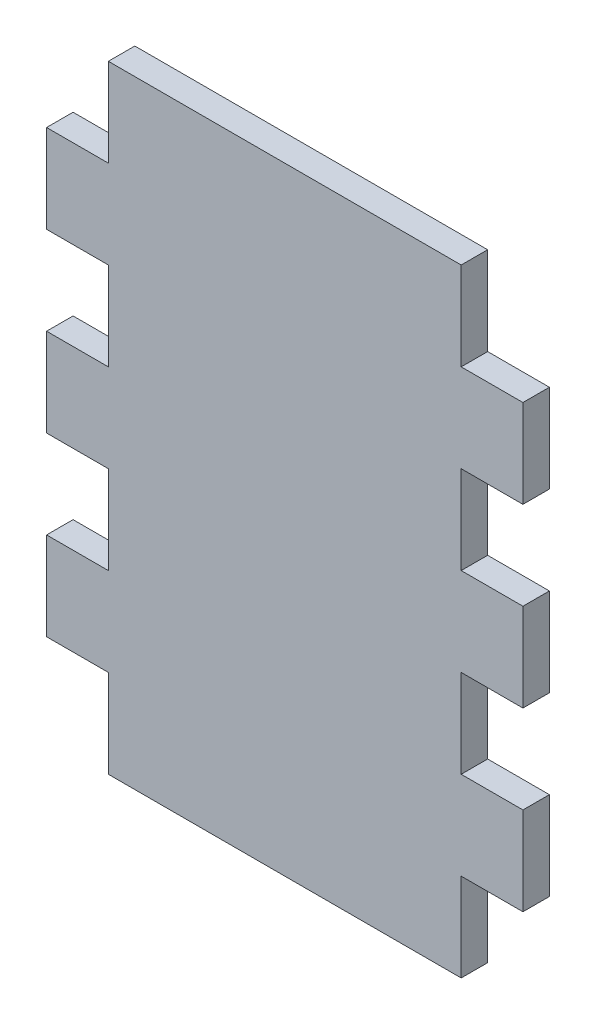
ISO-10303-21;
HEADER;
FILE_DESCRIPTION(('STEP AP214'),'2;1');
FILE_NAME('part.step','',(''),(''),'','','');
FILE_SCHEMA(('AUTOMOTIVE_DESIGN { 1 0 10303 214 1 1 1 1 }'));
ENDSEC;
DATA;
#1=APPLICATION_CONTEXT('core data for automotive mechanical design processes');
#2=APPLICATION_PROTOCOL_DEFINITION('international standard','automotive_design',2000,#1);
#3=PRODUCT_CONTEXT('',#1,'mechanical');
#4=PRODUCT('Part','Part','',(#3));
#5=PRODUCT_RELATED_PRODUCT_CATEGORY('part','',(#4));
#6=PRODUCT_DEFINITION_FORMATION('','',#4);
#7=PRODUCT_DEFINITION_CONTEXT('part definition',#1,'design');
#8=PRODUCT_DEFINITION('design','',#6,#7);
#9=PRODUCT_DEFINITION_SHAPE('','',#8);
#10=(LENGTH_UNIT() NAMED_UNIT(*) SI_UNIT(.MILLI.,.METRE.));
#11=(NAMED_UNIT(*) PLANE_ANGLE_UNIT() SI_UNIT($,.RADIAN.));
#12=(NAMED_UNIT(*) SI_UNIT($,.STERADIAN.) SOLID_ANGLE_UNIT());
#13=UNCERTAINTY_MEASURE_WITH_UNIT(LENGTH_MEASURE(1.E-05),#10,'distance_accuracy_value','');
#14=(GEOMETRIC_REPRESENTATION_CONTEXT(3) GLOBAL_UNCERTAINTY_ASSIGNED_CONTEXT((#13)) GLOBAL_UNIT_ASSIGNED_CONTEXT((#10,
#11,#12)) REPRESENTATION_CONTEXT('',''));
#15=CARTESIAN_POINT('',(0.,0.,0.));
#16=DIRECTION('',(0.,0.,1.));
#17=DIRECTION('',(1.,0.,0.));
#18=AXIS2_PLACEMENT_3D('',#15,#16,#17);
#19=CARTESIAN_POINT('',(0.,25.,3.));
#20=DIRECTION('',(0.,1.,0.));
#21=DIRECTION('',(0.,0.,1.));
#22=AXIS2_PLACEMENT_3D('',#19,#20,#21);
#23=PLANE('',#22);
#24=DIRECTION('',(1.,0.,0.));
#25=VECTOR('',#24,1.);
#26=CARTESIAN_POINT('',(0.,25.,0.));
#27=LINE('',#26,#25);
#28=CARTESIAN_POINT('',(20.,25.,0.));
#29=VERTEX_POINT('',#28);
#30=CARTESIAN_POINT('',(27.,25.,0.));
#31=VERTEX_POINT('',#30);
#32=EDGE_CURVE('E377',#29,#31,#27,.T.);
#33=ORIENTED_EDGE('',*,*,#32,.F.);
#34=DIRECTION('',(0.,0.,-1.));
#35=VECTOR('',#34,1.);
#36=CARTESIAN_POINT('',(20.,25.,3.));
#37=LINE('',#36,#35);
#38=CARTESIAN_POINT('',(20.,25.,3.));
#39=VERTEX_POINT('',#38);
#40=EDGE_CURVE('E211',#39,#29,#37,.T.);
#41=ORIENTED_EDGE('',*,*,#40,.F.);
#42=DIRECTION('',(1.,0.,0.));
#43=VECTOR('',#42,1.);
#44=CARTESIAN_POINT('',(0.,25.,3.));
#45=LINE('',#44,#43);
#46=CARTESIAN_POINT('',(27.,25.,3.));
#47=VERTEX_POINT('',#46);
#48=EDGE_CURVE('E457',#39,#47,#45,.T.);
#49=ORIENTED_EDGE('',*,*,#48,.T.);
#50=DIRECTION('',(0.,0.,-1.));
#51=VECTOR('',#50,1.);
#52=CARTESIAN_POINT('',(27.,25.,3.));
#53=LINE('',#52,#51);
#54=EDGE_CURVE('E207',#47,#31,#53,.T.);
#55=ORIENTED_EDGE('',*,*,#54,.T.);
#56=EDGE_LOOP('',(#33,#41,#49,#55));
#57=FACE_BOUND('',#56,.T.);
#58=ADVANCED_FACE('F127',(#57),#23,.T.);
#59=CARTESIAN_POINT('',(20.,0.,3.));
#60=DIRECTION('',(-1.,0.,0.));
#61=DIRECTION('',(0.,-1.,0.));
#62=AXIS2_PLACEMENT_3D('',#59,#60,#61);
#63=PLANE('',#62);
#64=DIRECTION('',(0.,1.,0.));
#65=VECTOR('',#64,1.);
#66=CARTESIAN_POINT('',(20.,0.,0.));
#67=LINE('',#66,#65);
#68=CARTESIAN_POINT('',(20.,35.,0.));
#69=VERTEX_POINT('',#68);
#70=EDGE_CURVE('E373',#29,#69,#67,.T.);
#71=ORIENTED_EDGE('',*,*,#70,.T.);
#72=DIRECTION('',(0.,0.,-1.));
#73=VECTOR('',#72,1.);
#74=CARTESIAN_POINT('',(20.,35.,3.));
#75=LINE('',#74,#73);
#76=CARTESIAN_POINT('',(20.,35.,3.));
#77=VERTEX_POINT('',#76);
#78=EDGE_CURVE('E215',#77,#69,#75,.T.);
#79=ORIENTED_EDGE('',*,*,#78,.F.);
#80=DIRECTION('',(0.,1.,0.));
#81=VECTOR('',#80,1.);
#82=CARTESIAN_POINT('',(20.,0.,3.));
#83=LINE('',#82,#81);
#84=EDGE_CURVE('E453',#39,#77,#83,.T.);
#85=ORIENTED_EDGE('',*,*,#84,.F.);
#86=ORIENTED_EDGE('',*,*,#40,.T.);
#87=EDGE_LOOP('',(#71,#79,#85,#86));
#88=FACE_BOUND('',#87,.T.);
#89=ADVANCED_FACE('F491',(#88),#63,.F.);
#90=CARTESIAN_POINT('',(0.,35.,3.));
#91=DIRECTION('',(0.,1.,0.));
#92=DIRECTION('',(0.,0.,1.));
#93=AXIS2_PLACEMENT_3D('',#90,#91,#92);
#94=PLANE('',#93);
#95=DIRECTION('',(1.,0.,0.));
#96=VECTOR('',#95,1.);
#97=CARTESIAN_POINT('',(0.,35.,0.));
#98=LINE('',#97,#96);
#99=CARTESIAN_POINT('',(-20.,35.,0.));
#100=VERTEX_POINT('',#99);
#101=EDGE_CURVE('E369',#100,#69,#98,.T.);
#102=ORIENTED_EDGE('',*,*,#101,.F.);
#103=DIRECTION('',(0.,0.,-1.));
#104=VECTOR('',#103,1.);
#105=CARTESIAN_POINT('',(-20.,35.,3.));
#106=LINE('',#105,#104);
#107=CARTESIAN_POINT('',(-20.,35.,3.));
#108=VERTEX_POINT('',#107);
#109=EDGE_CURVE('E219',#108,#100,#106,.T.);
#110=ORIENTED_EDGE('',*,*,#109,.F.);
#111=DIRECTION('',(1.,0.,0.));
#112=VECTOR('',#111,1.);
#113=CARTESIAN_POINT('',(0.,35.,3.));
#114=LINE('',#113,#112);
#115=EDGE_CURVE('E449',#108,#77,#114,.T.);
#116=ORIENTED_EDGE('',*,*,#115,.T.);
#117=ORIENTED_EDGE('',*,*,#78,.T.);
#118=EDGE_LOOP('',(#102,#110,#116,#117));
#119=FACE_BOUND('',#118,.T.);
#120=ADVANCED_FACE('F666',(#119),#94,.T.);
#121=CARTESIAN_POINT('',(-20.,0.,3.));
#122=DIRECTION('',(-1.,0.,0.));
#123=DIRECTION('',(0.,0.,1.));
#124=AXIS2_PLACEMENT_3D('',#121,#122,#123);
#125=PLANE('',#124);
#126=DIRECTION('',(0.,1.,0.));
#127=VECTOR('',#126,1.);
#128=CARTESIAN_POINT('',(-20.,0.,0.));
#129=LINE('',#128,#127);
#130=CARTESIAN_POINT('',(-20.,25.,0.));
#131=VERTEX_POINT('',#130);
#132=EDGE_CURVE('E368',#131,#100,#129,.T.);
#133=ORIENTED_EDGE('',*,*,#132,.F.);
#134=DIRECTION('',(0.,0.,1.));
#135=VECTOR('',#134,1.);
#136=CARTESIAN_POINT('',(-20.,25.,3.));
#137=LINE('',#136,#135);
#138=CARTESIAN_POINT('',(-20.,25.,3.));
#139=VERTEX_POINT('',#138);
#140=EDGE_CURVE('E12',#131,#139,#137,.T.);
#141=ORIENTED_EDGE('',*,*,#140,.T.);
#142=DIRECTION('',(0.,1.,0.));
#143=VECTOR('',#142,1.);
#144=CARTESIAN_POINT('',(-20.,0.,3.));
#145=LINE('',#144,#143);
#146=EDGE_CURVE('E448',#139,#108,#145,.T.);
#147=ORIENTED_EDGE('',*,*,#146,.T.);
#148=ORIENTED_EDGE('',*,*,#109,.T.);
#149=EDGE_LOOP('',(#133,#141,#147,#148));
#150=FACE_BOUND('',#149,.T.);
#151=ADVANCED_FACE('F597',(#150),#125,.T.);
#152=DIRECTION('',(0.,0.,1.));
#153=VECTOR('',#152,1.);
#154=CARTESIAN_POINT('',(-20.,15.,3.));
#155=LINE('',#154,#153);
#156=CARTESIAN_POINT('',(-20.,15.,0.));
#157=VERTEX_POINT('',#156);
#158=CARTESIAN_POINT('',(-20.,15.,3.));
#159=VERTEX_POINT('',#158);
#160=EDGE_CURVE('E138',#157,#159,#155,.T.);
#161=ORIENTED_EDGE('',*,*,#160,.F.);
#162=CARTESIAN_POINT('',(-20.,4.99999999999998,0.));
#163=VERTEX_POINT('',#162);
#164=EDGE_CURVE('E190',#163,#157,#129,.T.);
#165=ORIENTED_EDGE('',*,*,#164,.F.);
#166=DIRECTION('',(0.,0.,-1.));
#167=VECTOR('',#166,1.);
#168=CARTESIAN_POINT('',(-20.,4.99999999999998,3.));
#169=LINE('',#168,#167);
#170=CARTESIAN_POINT('',(-20.,4.99999999999998,3.));
#171=VERTEX_POINT('',#170);
#172=EDGE_CURVE('E223',#171,#163,#169,.T.);
#173=ORIENTED_EDGE('',*,*,#172,.F.);
#174=EDGE_CURVE('E444',#171,#159,#145,.T.);
#175=ORIENTED_EDGE('',*,*,#174,.T.);
#176=EDGE_LOOP('',(#161,#165,#173,#175));
#177=FACE_BOUND('',#176,.T.);
#178=ADVANCED_FACE('F627',(#177),#125,.T.);
#179=CARTESIAN_POINT('',(0.,4.99999999999999,3.));
#180=DIRECTION('',(0.,-1.,0.));
#181=DIRECTION('',(1.,0.,0.));
#182=AXIS2_PLACEMENT_3D('',#179,#180,#181);
#183=PLANE('',#182);
#184=DIRECTION('',(-1.,0.,0.));
#185=VECTOR('',#184,1.);
#186=CARTESIAN_POINT('',(0.,4.99999999999999,0.));
#187=LINE('',#186,#185);
#188=CARTESIAN_POINT('',(-27.,4.99999999999998,0.));
#189=VERTEX_POINT('',#188);
#190=EDGE_CURVE('E362',#163,#189,#187,.T.);
#191=ORIENTED_EDGE('',*,*,#190,.T.);
#192=DIRECTION('',(0.,0.,-1.));
#193=VECTOR('',#192,1.);
#194=CARTESIAN_POINT('',(-27.,4.99999999999998,3.));
#195=LINE('',#194,#193);
#196=CARTESIAN_POINT('',(-27.,4.99999999999998,3.));
#197=VERTEX_POINT('',#196);
#198=EDGE_CURVE('E227',#197,#189,#195,.T.);
#199=ORIENTED_EDGE('',*,*,#198,.F.);
#200=DIRECTION('',(-1.,0.,0.));
#201=VECTOR('',#200,1.);
#202=CARTESIAN_POINT('',(0.,4.99999999999999,3.));
#203=LINE('',#202,#201);
#204=EDGE_CURVE('E440',#171,#197,#203,.T.);
#205=ORIENTED_EDGE('',*,*,#204,.F.);
#206=ORIENTED_EDGE('',*,*,#172,.T.);
#207=EDGE_LOOP('',(#191,#199,#205,#206));
#208=FACE_BOUND('',#207,.T.);
#209=ADVANCED_FACE('F651',(#208),#183,.F.);
#210=CARTESIAN_POINT('',(-27.,0.,3.));
#211=DIRECTION('',(1.,0.,0.));
#212=DIRECTION('',(0.,1.,0.));
#213=AXIS2_PLACEMENT_3D('',#210,#211,#212);
#214=PLANE('',#213);
#215=DIRECTION('',(0.,-1.,0.));
#216=VECTOR('',#215,1.);
#217=CARTESIAN_POINT('',(-27.,0.,0.));
#218=LINE('',#217,#216);
#219=CARTESIAN_POINT('',(-27.,-5.00000000000002,0.));
#220=VERTEX_POINT('',#219);
#221=EDGE_CURVE('E358',#189,#220,#218,.T.);
#222=ORIENTED_EDGE('',*,*,#221,.T.);
#223=DIRECTION('',(0.,0.,-1.));
#224=VECTOR('',#223,1.);
#225=CARTESIAN_POINT('',(-27.,-5.00000000000002,3.));
#226=LINE('',#225,#224);
#227=CARTESIAN_POINT('',(-27.,-5.00000000000002,3.));
#228=VERTEX_POINT('',#227);
#229=EDGE_CURVE('E231',#228,#220,#226,.T.);
#230=ORIENTED_EDGE('',*,*,#229,.F.);
#231=DIRECTION('',(0.,-1.,0.));
#232=VECTOR('',#231,1.);
#233=CARTESIAN_POINT('',(-27.,0.,3.));
#234=LINE('',#233,#232);
#235=EDGE_CURVE('E436',#197,#228,#234,.T.);
#236=ORIENTED_EDGE('',*,*,#235,.F.);
#237=ORIENTED_EDGE('',*,*,#198,.T.);
#238=EDGE_LOOP('',(#222,#230,#236,#237));
#239=FACE_BOUND('',#238,.T.);
#240=ADVANCED_FACE('F623',(#239),#214,.F.);
#241=CARTESIAN_POINT('',(0.,-5.00000000000001,3.));
#242=DIRECTION('',(0.,-1.,0.));
#243=DIRECTION('',(1.,0.,0.));
#244=AXIS2_PLACEMENT_3D('',#241,#242,#243);
#245=PLANE('',#244);
#246=DIRECTION('',(-1.,0.,0.));
#247=VECTOR('',#246,1.);
#248=CARTESIAN_POINT('',(0.,-5.00000000000001,0.));
#249=LINE('',#248,#247);
#250=CARTESIAN_POINT('',(-20.,-5.00000000000002,0.));
#251=VERTEX_POINT('',#250);
#252=EDGE_CURVE('E354',#251,#220,#249,.T.);
#253=ORIENTED_EDGE('',*,*,#252,.F.);
#254=DIRECTION('',(0.,0.,-1.));
#255=VECTOR('',#254,1.);
#256=CARTESIAN_POINT('',(-20.,-5.00000000000002,3.));
#257=LINE('',#256,#255);
#258=CARTESIAN_POINT('',(-20.,-5.00000000000002,3.));
#259=VERTEX_POINT('',#258);
#260=EDGE_CURVE('E235',#259,#251,#257,.T.);
#261=ORIENTED_EDGE('',*,*,#260,.F.);
#262=DIRECTION('',(-1.,0.,0.));
#263=VECTOR('',#262,1.);
#264=CARTESIAN_POINT('',(0.,-5.00000000000001,3.));
#265=LINE('',#264,#263);
#266=EDGE_CURVE('E432',#259,#228,#265,.T.);
#267=ORIENTED_EDGE('',*,*,#266,.T.);
#268=ORIENTED_EDGE('',*,*,#229,.T.);
#269=EDGE_LOOP('',(#253,#261,#267,#268));
#270=FACE_BOUND('',#269,.T.);
#271=ADVANCED_FACE('F619',(#270),#245,.T.);
#272=CARTESIAN_POINT('',(-20.,-15.,0.));
#273=VERTEX_POINT('',#272);
#274=EDGE_CURVE('E353',#273,#251,#129,.T.);
#275=ORIENTED_EDGE('',*,*,#274,.F.);
#276=DIRECTION('',(0.,0.,-1.));
#277=VECTOR('',#276,1.);
#278=CARTESIAN_POINT('',(-20.,-15.,3.));
#279=LINE('',#278,#277);
#280=CARTESIAN_POINT('',(-20.,-15.,3.));
#281=VERTEX_POINT('',#280);
#282=EDGE_CURVE('E239',#281,#273,#279,.T.);
#283=ORIENTED_EDGE('',*,*,#282,.F.);
#284=EDGE_CURVE('E431',#281,#259,#145,.T.);
#285=ORIENTED_EDGE('',*,*,#284,.T.);
#286=ORIENTED_EDGE('',*,*,#260,.T.);
#287=EDGE_LOOP('',(#275,#283,#285,#286));
#288=FACE_BOUND('',#287,.T.);
#289=ADVANCED_FACE('F613',(#288),#125,.T.);
#290=CARTESIAN_POINT('',(0.,-15.,3.));
#291=DIRECTION('',(0.,-1.,0.));
#292=DIRECTION('',(1.,0.,0.));
#293=AXIS2_PLACEMENT_3D('',#290,#291,#292);
#294=PLANE('',#293);
#295=DIRECTION('',(-1.,0.,0.));
#296=VECTOR('',#295,1.);
#297=CARTESIAN_POINT('',(0.,-15.,0.));
#298=LINE('',#297,#296);
#299=CARTESIAN_POINT('',(-27.,-15.,0.));
#300=VERTEX_POINT('',#299);
#301=EDGE_CURVE('E349',#273,#300,#298,.T.);
#302=ORIENTED_EDGE('',*,*,#301,.T.);
#303=DIRECTION('',(0.,0.,-1.));
#304=VECTOR('',#303,1.);
#305=CARTESIAN_POINT('',(-27.,-15.,3.));
#306=LINE('',#305,#304);
#307=CARTESIAN_POINT('',(-27.,-15.,3.));
#308=VERTEX_POINT('',#307);
#309=EDGE_CURVE('E243',#308,#300,#306,.T.);
#310=ORIENTED_EDGE('',*,*,#309,.F.);
#311=DIRECTION('',(-1.,0.,0.));
#312=VECTOR('',#311,1.);
#313=CARTESIAN_POINT('',(0.,-15.,3.));
#314=LINE('',#313,#312);
#315=EDGE_CURVE('E427',#281,#308,#314,.T.);
#316=ORIENTED_EDGE('',*,*,#315,.F.);
#317=ORIENTED_EDGE('',*,*,#282,.T.);
#318=EDGE_LOOP('',(#302,#310,#316,#317));
#319=FACE_BOUND('',#318,.T.);
#320=ADVANCED_FACE('F650',(#319),#294,.F.);
#321=CARTESIAN_POINT('',(-27.,0.,3.));
#322=DIRECTION('',(1.,0.,0.));
#323=DIRECTION('',(0.,0.,-1.));
#324=AXIS2_PLACEMENT_3D('',#321,#322,#323);
#325=PLANE('',#324);
#326=DIRECTION('',(0.,-1.,0.));
#327=VECTOR('',#326,1.);
#328=CARTESIAN_POINT('',(-27.,0.,0.));
#329=LINE('',#328,#327);
#330=CARTESIAN_POINT('',(-27.,-25.,0.));
#331=VERTEX_POINT('',#330);
#332=EDGE_CURVE('E345',#300,#331,#329,.T.);
#333=ORIENTED_EDGE('',*,*,#332,.T.);
#334=DIRECTION('',(0.,0.,-1.));
#335=VECTOR('',#334,1.);
#336=CARTESIAN_POINT('',(-27.,-25.,3.));
#337=LINE('',#336,#335);
#338=CARTESIAN_POINT('',(-27.,-25.,3.));
#339=VERTEX_POINT('',#338);
#340=EDGE_CURVE('E247',#339,#331,#337,.T.);
#341=ORIENTED_EDGE('',*,*,#340,.F.);
#342=DIRECTION('',(0.,-1.,0.));
#343=VECTOR('',#342,1.);
#344=CARTESIAN_POINT('',(-27.,0.,3.));
#345=LINE('',#344,#343);
#346=EDGE_CURVE('E423',#308,#339,#345,.T.);
#347=ORIENTED_EDGE('',*,*,#346,.F.);
#348=ORIENTED_EDGE('',*,*,#309,.T.);
#349=EDGE_LOOP('',(#333,#341,#347,#348));
#350=FACE_BOUND('',#349,.T.);
#351=ADVANCED_FACE('F647',(#350),#325,.F.);
#352=CARTESIAN_POINT('',(0.,-25.,3.));
#353=DIRECTION('',(0.,-1.,0.));
#354=DIRECTION('',(1.,0.,0.));
#355=AXIS2_PLACEMENT_3D('',#352,#353,#354);
#356=PLANE('',#355);
#357=DIRECTION('',(-1.,0.,0.));
#358=VECTOR('',#357,1.);
#359=CARTESIAN_POINT('',(0.,-25.,0.));
#360=LINE('',#359,#358);
#361=CARTESIAN_POINT('',(-20.,-25.,0.));
#362=VERTEX_POINT('',#361);
#363=EDGE_CURVE('E341',#362,#331,#360,.T.);
#364=ORIENTED_EDGE('',*,*,#363,.F.);
#365=DIRECTION('',(0.,0.,-1.));
#366=VECTOR('',#365,1.);
#367=CARTESIAN_POINT('',(-20.,-25.,3.));
#368=LINE('',#367,#366);
#369=CARTESIAN_POINT('',(-20.,-25.,3.));
#370=VERTEX_POINT('',#369);
#371=EDGE_CURVE('E251',#370,#362,#368,.T.);
#372=ORIENTED_EDGE('',*,*,#371,.F.);
#373=DIRECTION('',(-1.,0.,0.));
#374=VECTOR('',#373,1.);
#375=CARTESIAN_POINT('',(0.,-25.,3.));
#376=LINE('',#375,#374);
#377=EDGE_CURVE('E419',#370,#339,#376,.T.);
#378=ORIENTED_EDGE('',*,*,#377,.T.);
#379=ORIENTED_EDGE('',*,*,#340,.T.);
#380=EDGE_LOOP('',(#364,#372,#378,#379));
#381=FACE_BOUND('',#380,.T.);
#382=ADVANCED_FACE('F645',(#381),#356,.T.);
#383=CARTESIAN_POINT('',(-20.,-35.,0.));
#384=VERTEX_POINT('',#383);
#385=EDGE_CURVE('E340',#384,#362,#129,.T.);
#386=ORIENTED_EDGE('',*,*,#385,.F.);
#387=DIRECTION('',(0.,0.,-1.));
#388=VECTOR('',#387,1.);
#389=CARTESIAN_POINT('',(-20.,-35.,3.));
#390=LINE('',#389,#388);
#391=CARTESIAN_POINT('',(-20.,-35.,3.));
#392=VERTEX_POINT('',#391);
#393=EDGE_CURVE('E255',#392,#384,#390,.T.);
#394=ORIENTED_EDGE('',*,*,#393,.F.);
#395=EDGE_CURVE('E418',#392,#370,#145,.T.);
#396=ORIENTED_EDGE('',*,*,#395,.T.);
#397=ORIENTED_EDGE('',*,*,#371,.T.);
#398=EDGE_LOOP('',(#386,#394,#396,#397));
#399=FACE_BOUND('',#398,.T.);
#400=ADVANCED_FACE('F637',(#399),#125,.T.);
#401=CARTESIAN_POINT('',(0.,-35.,3.));
#402=DIRECTION('',(0.,1.,0.));
#403=DIRECTION('',(-1.,0.,0.));
#404=AXIS2_PLACEMENT_3D('',#401,#402,#403);
#405=PLANE('',#404);
#406=DIRECTION('',(1.,0.,0.));
#407=VECTOR('',#406,1.);
#408=CARTESIAN_POINT('',(0.,-35.,0.));
#409=LINE('',#408,#407);
#410=CARTESIAN_POINT('',(20.,-35.,0.));
#411=VERTEX_POINT('',#410);
#412=EDGE_CURVE('E336',#384,#411,#409,.T.);
#413=ORIENTED_EDGE('',*,*,#412,.T.);
#414=DIRECTION('',(0.,0.,-1.));
#415=VECTOR('',#414,1.);
#416=CARTESIAN_POINT('',(20.,-35.,3.));
#417=LINE('',#416,#415);
#418=CARTESIAN_POINT('',(20.,-35.,3.));
#419=VERTEX_POINT('',#418);
#420=EDGE_CURVE('E259',#419,#411,#417,.T.);
#421=ORIENTED_EDGE('',*,*,#420,.F.);
#422=DIRECTION('',(1.,0.,0.));
#423=VECTOR('',#422,1.);
#424=CARTESIAN_POINT('',(0.,-35.,3.));
#425=LINE('',#424,#423);
#426=EDGE_CURVE('E414',#392,#419,#425,.T.);
#427=ORIENTED_EDGE('',*,*,#426,.F.);
#428=ORIENTED_EDGE('',*,*,#393,.T.);
#429=EDGE_LOOP('',(#413,#421,#427,#428));
#430=FACE_BOUND('',#429,.T.);
#431=ADVANCED_FACE('F814',(#430),#405,.F.);
#432=CARTESIAN_POINT('',(20.,-25.,0.));
#433=VERTEX_POINT('',#432);
#434=EDGE_CURVE('E335',#411,#433,#67,.T.);
#435=ORIENTED_EDGE('',*,*,#434,.T.);
#436=DIRECTION('',(0.,0.,-1.));
#437=VECTOR('',#436,1.);
#438=CARTESIAN_POINT('',(20.,-25.,3.));
#439=LINE('',#438,#437);
#440=CARTESIAN_POINT('',(20.,-25.,3.));
#441=VERTEX_POINT('',#440);
#442=EDGE_CURVE('E263',#441,#433,#439,.T.);
#443=ORIENTED_EDGE('',*,*,#442,.F.);
#444=EDGE_CURVE('E413',#419,#441,#83,.T.);
#445=ORIENTED_EDGE('',*,*,#444,.F.);
#446=ORIENTED_EDGE('',*,*,#420,.T.);
#447=EDGE_LOOP('',(#435,#443,#445,#446));
#448=FACE_BOUND('',#447,.T.);
#449=ADVANCED_FACE('F668',(#448),#63,.F.);
#450=CARTESIAN_POINT('',(0.,-25.,3.));
#451=DIRECTION('',(0.,1.,0.));
#452=DIRECTION('',(0.,0.,1.));
#453=AXIS2_PLACEMENT_3D('',#450,#451,#452);
#454=PLANE('',#453);
#455=DIRECTION('',(1.,0.,0.));
#456=VECTOR('',#455,1.);
#457=CARTESIAN_POINT('',(0.,-25.,0.));
#458=LINE('',#457,#456);
#459=CARTESIAN_POINT('',(27.,-25.,0.));
#460=VERTEX_POINT('',#459);
#461=EDGE_CURVE('E331',#433,#460,#458,.T.);
#462=ORIENTED_EDGE('',*,*,#461,.T.);
#463=DIRECTION('',(0.,0.,-1.));
#464=VECTOR('',#463,1.);
#465=CARTESIAN_POINT('',(27.,-25.,3.));
#466=LINE('',#465,#464);
#467=CARTESIAN_POINT('',(27.,-25.,3.));
#468=VERTEX_POINT('',#467);
#469=EDGE_CURVE('E267',#468,#460,#466,.T.);
#470=ORIENTED_EDGE('',*,*,#469,.F.);
#471=DIRECTION('',(1.,0.,0.));
#472=VECTOR('',#471,1.);
#473=CARTESIAN_POINT('',(0.,-25.,3.));
#474=LINE('',#473,#472);
#475=EDGE_CURVE('E409',#441,#468,#474,.T.);
#476=ORIENTED_EDGE('',*,*,#475,.F.);
#477=ORIENTED_EDGE('',*,*,#442,.T.);
#478=EDGE_LOOP('',(#462,#470,#476,#477));
#479=FACE_BOUND('',#478,.T.);
#480=ADVANCED_FACE('F795',(#479),#454,.F.);
#481=CARTESIAN_POINT('',(27.,0.,3.));
#482=DIRECTION('',(1.,0.,0.));
#483=DIRECTION('',(0.,0.,-1.));
#484=AXIS2_PLACEMENT_3D('',#481,#482,#483);
#485=PLANE('',#484);
#486=DIRECTION('',(0.,-1.,0.));
#487=VECTOR('',#486,1.);
#488=CARTESIAN_POINT('',(27.,0.,0.));
#489=LINE('',#488,#487);
#490=CARTESIAN_POINT('',(27.,-15.,0.));
#491=VERTEX_POINT('',#490);
#492=EDGE_CURVE('E327',#491,#460,#489,.T.);
#493=ORIENTED_EDGE('',*,*,#492,.F.);
#494=DIRECTION('',(0.,0.,-1.));
#495=VECTOR('',#494,1.);
#496=CARTESIAN_POINT('',(27.,-15.,3.));
#497=LINE('',#496,#495);
#498=CARTESIAN_POINT('',(27.,-15.,3.));
#499=VERTEX_POINT('',#498);
#500=EDGE_CURVE('E271',#499,#491,#497,.T.);
#501=ORIENTED_EDGE('',*,*,#500,.F.);
#502=DIRECTION('',(0.,-1.,0.));
#503=VECTOR('',#502,1.);
#504=CARTESIAN_POINT('',(27.,0.,3.));
#505=LINE('',#504,#503);
#506=EDGE_CURVE('E405',#499,#468,#505,.T.);
#507=ORIENTED_EDGE('',*,*,#506,.T.);
#508=ORIENTED_EDGE('',*,*,#469,.T.);
#509=EDGE_LOOP('',(#493,#501,#507,#508));
#510=FACE_BOUND('',#509,.T.);
#511=ADVANCED_FACE('F784',(#510),#485,.T.);
#512=CARTESIAN_POINT('',(0.,-15.,3.));
#513=DIRECTION('',(0.,1.,0.));
#514=DIRECTION('',(0.,0.,1.));
#515=AXIS2_PLACEMENT_3D('',#512,#513,#514);
#516=PLANE('',#515);
#517=DIRECTION('',(1.,0.,0.));
#518=VECTOR('',#517,1.);
#519=CARTESIAN_POINT('',(0.,-15.,0.));
#520=LINE('',#519,#518);
#521=CARTESIAN_POINT('',(20.,-15.,0.));
#522=VERTEX_POINT('',#521);
#523=EDGE_CURVE('E323',#522,#491,#520,.T.);
#524=ORIENTED_EDGE('',*,*,#523,.F.);
#525=DIRECTION('',(0.,0.,-1.));
#526=VECTOR('',#525,1.);
#527=CARTESIAN_POINT('',(20.,-15.,3.));
#528=LINE('',#527,#526);
#529=CARTESIAN_POINT('',(20.,-15.,3.));
#530=VERTEX_POINT('',#529);
#531=EDGE_CURVE('E275',#530,#522,#528,.T.);
#532=ORIENTED_EDGE('',*,*,#531,.F.);
#533=DIRECTION('',(1.,0.,0.));
#534=VECTOR('',#533,1.);
#535=CARTESIAN_POINT('',(0.,-15.,3.));
#536=LINE('',#535,#534);
#537=EDGE_CURVE('E401',#530,#499,#536,.T.);
#538=ORIENTED_EDGE('',*,*,#537,.T.);
#539=ORIENTED_EDGE('',*,*,#500,.T.);
#540=EDGE_LOOP('',(#524,#532,#538,#539));
#541=FACE_BOUND('',#540,.T.);
#542=ADVANCED_FACE('F774',(#541),#516,.T.);
#543=CARTESIAN_POINT('',(20.,-5.00000000000001,0.));
#544=VERTEX_POINT('',#543);
#545=EDGE_CURVE('E322',#522,#544,#67,.T.);
#546=ORIENTED_EDGE('',*,*,#545,.T.);
#547=DIRECTION('',(0.,0.,-1.));
#548=VECTOR('',#547,1.);
#549=CARTESIAN_POINT('',(20.,-5.00000000000001,3.));
#550=LINE('',#549,#548);
#551=CARTESIAN_POINT('',(20.,-5.00000000000001,3.));
#552=VERTEX_POINT('',#551);
#553=EDGE_CURVE('E279',#552,#544,#550,.T.);
#554=ORIENTED_EDGE('',*,*,#553,.F.);
#555=EDGE_CURVE('E400',#530,#552,#83,.T.);
#556=ORIENTED_EDGE('',*,*,#555,.F.);
#557=ORIENTED_EDGE('',*,*,#531,.T.);
#558=EDGE_LOOP('',(#546,#554,#556,#557));
#559=FACE_BOUND('',#558,.T.);
#560=ADVANCED_FACE('F735',(#559),#63,.F.);
#561=CARTESIAN_POINT('',(0.,-5.00000000000001,3.));
#562=DIRECTION('',(0.,1.,0.));
#563=DIRECTION('',(-1.,0.,0.));
#564=AXIS2_PLACEMENT_3D('',#561,#562,#563);
#565=PLANE('',#564);
#566=DIRECTION('',(1.,0.,0.));
#567=VECTOR('',#566,1.);
#568=CARTESIAN_POINT('',(0.,-5.00000000000001,0.));
#569=LINE('',#568,#567);
#570=CARTESIAN_POINT('',(27.,-5.00000000000001,0.));
#571=VERTEX_POINT('',#570);
#572=EDGE_CURVE('E318',#544,#571,#569,.T.);
#573=ORIENTED_EDGE('',*,*,#572,.T.);
#574=DIRECTION('',(0.,0.,-1.));
#575=VECTOR('',#574,1.);
#576=CARTESIAN_POINT('',(27.,-5.00000000000001,3.));
#577=LINE('',#576,#575);
#578=CARTESIAN_POINT('',(27.,-5.00000000000001,3.));
#579=VERTEX_POINT('',#578);
#580=EDGE_CURVE('E283',#579,#571,#577,.T.);
#581=ORIENTED_EDGE('',*,*,#580,.F.);
#582=DIRECTION('',(1.,0.,0.));
#583=VECTOR('',#582,1.);
#584=CARTESIAN_POINT('',(0.,-5.00000000000001,3.));
#585=LINE('',#584,#583);
#586=EDGE_CURVE('E396',#552,#579,#585,.T.);
#587=ORIENTED_EDGE('',*,*,#586,.F.);
#588=ORIENTED_EDGE('',*,*,#553,.T.);
#589=EDGE_LOOP('',(#573,#581,#587,#588));
#590=FACE_BOUND('',#589,.T.);
#591=ADVANCED_FACE('F755',(#590),#565,.F.);
#592=CARTESIAN_POINT('',(27.,0.,3.));
#593=DIRECTION('',(1.,0.,0.));
#594=DIRECTION('',(0.,1.,0.));
#595=AXIS2_PLACEMENT_3D('',#592,#593,#594);
#596=PLANE('',#595);
#597=DIRECTION('',(0.,-1.,0.));
#598=VECTOR('',#597,1.);
#599=CARTESIAN_POINT('',(27.,0.,0.));
#600=LINE('',#599,#598);
#601=CARTESIAN_POINT('',(27.,4.99999999999999,0.));
#602=VERTEX_POINT('',#601);
#603=EDGE_CURVE('E314',#602,#571,#600,.T.);
#604=ORIENTED_EDGE('',*,*,#603,.F.);
#605=DIRECTION('',(0.,0.,-1.));
#606=VECTOR('',#605,1.);
#607=CARTESIAN_POINT('',(27.,4.99999999999999,3.));
#608=LINE('',#607,#606);
#609=CARTESIAN_POINT('',(27.,4.99999999999999,3.));
#610=VERTEX_POINT('',#609);
#611=EDGE_CURVE('E287',#610,#602,#608,.T.);
#612=ORIENTED_EDGE('',*,*,#611,.F.);
#613=DIRECTION('',(0.,-1.,0.));
#614=VECTOR('',#613,1.);
#615=CARTESIAN_POINT('',(27.,0.,3.));
#616=LINE('',#615,#614);
#617=EDGE_CURVE('E392',#610,#579,#616,.T.);
#618=ORIENTED_EDGE('',*,*,#617,.T.);
#619=ORIENTED_EDGE('',*,*,#580,.T.);
#620=EDGE_LOOP('',(#604,#612,#618,#619));
#621=FACE_BOUND('',#620,.T.);
#622=ADVANCED_FACE('F744',(#621),#596,.T.);
#623=CARTESIAN_POINT('',(0.,4.99999999999999,3.));
#624=DIRECTION('',(0.,1.,0.));
#625=DIRECTION('',(-1.,0.,0.));
#626=AXIS2_PLACEMENT_3D('',#623,#624,#625);
#627=PLANE('',#626);
#628=DIRECTION('',(1.,0.,0.));
#629=VECTOR('',#628,1.);
#630=CARTESIAN_POINT('',(0.,4.99999999999999,0.));
#631=LINE('',#630,#629);
#632=CARTESIAN_POINT('',(20.,4.99999999999999,0.));
#633=VERTEX_POINT('',#632);
#634=EDGE_CURVE('E310',#633,#602,#631,.T.);
#635=ORIENTED_EDGE('',*,*,#634,.F.);
#636=DIRECTION('',(0.,0.,-1.));
#637=VECTOR('',#636,1.);
#638=CARTESIAN_POINT('',(20.,4.99999999999999,3.));
#639=LINE('',#638,#637);
#640=CARTESIAN_POINT('',(20.,4.99999999999999,3.));
#641=VERTEX_POINT('',#640);
#642=EDGE_CURVE('E291',#641,#633,#639,.T.);
#643=ORIENTED_EDGE('',*,*,#642,.F.);
#644=DIRECTION('',(1.,0.,0.));
#645=VECTOR('',#644,1.);
#646=CARTESIAN_POINT('',(0.,4.99999999999999,3.));
#647=LINE('',#646,#645);
#648=EDGE_CURVE('E388',#641,#610,#647,.T.);
#649=ORIENTED_EDGE('',*,*,#648,.T.);
#650=ORIENTED_EDGE('',*,*,#611,.T.);
#651=EDGE_LOOP('',(#635,#643,#649,#650));
#652=FACE_BOUND('',#651,.T.);
#653=ADVANCED_FACE('F733',(#652),#627,.T.);
#654=CARTESIAN_POINT('',(20.,15.,0.));
#655=VERTEX_POINT('',#654);
#656=EDGE_CURVE('E309',#633,#655,#67,.T.);
#657=ORIENTED_EDGE('',*,*,#656,.T.);
#658=DIRECTION('',(0.,0.,-1.));
#659=VECTOR('',#658,1.);
#660=CARTESIAN_POINT('',(20.,15.,3.));
#661=LINE('',#660,#659);
#662=CARTESIAN_POINT('',(20.,15.,3.));
#663=VERTEX_POINT('',#662);
#664=EDGE_CURVE('E295',#663,#655,#661,.T.);
#665=ORIENTED_EDGE('',*,*,#664,.F.);
#666=EDGE_CURVE('E387',#641,#663,#83,.T.);
#667=ORIENTED_EDGE('',*,*,#666,.F.);
#668=ORIENTED_EDGE('',*,*,#642,.T.);
#669=EDGE_LOOP('',(#657,#665,#667,#668));
#670=FACE_BOUND('',#669,.T.);
#671=ADVANCED_FACE('F669',(#670),#63,.F.);
#672=CARTESIAN_POINT('',(0.,15.,3.));
#673=DIRECTION('',(0.,1.,0.));
#674=DIRECTION('',(0.,0.,1.));
#675=AXIS2_PLACEMENT_3D('',#672,#673,#674);
#676=PLANE('',#675);
#677=DIRECTION('',(1.,0.,0.));
#678=VECTOR('',#677,1.);
#679=CARTESIAN_POINT('',(0.,15.,0.));
#680=LINE('',#679,#678);
#681=CARTESIAN_POINT('',(27.,15.,0.));
#682=VERTEX_POINT('',#681);
#683=EDGE_CURVE('E304',#655,#682,#680,.T.);
#684=ORIENTED_EDGE('',*,*,#683,.T.);
#685=DIRECTION('',(0.,0.,-1.));
#686=VECTOR('',#685,1.);
#687=CARTESIAN_POINT('',(27.,15.,3.));
#688=LINE('',#687,#686);
#689=CARTESIAN_POINT('',(27.,15.,3.));
#690=VERTEX_POINT('',#689);
#691=EDGE_CURVE('E299',#690,#682,#688,.T.);
#692=ORIENTED_EDGE('',*,*,#691,.F.);
#693=DIRECTION('',(1.,0.,0.));
#694=VECTOR('',#693,1.);
#695=CARTESIAN_POINT('',(0.,15.,3.));
#696=LINE('',#695,#694);
#697=EDGE_CURVE('E303',#663,#690,#696,.T.);
#698=ORIENTED_EDGE('',*,*,#697,.F.);
#699=ORIENTED_EDGE('',*,*,#664,.T.);
#700=EDGE_LOOP('',(#684,#692,#698,#699));
#701=FACE_BOUND('',#700,.T.);
#702=ADVANCED_FACE('F673',(#701),#676,.F.);
#703=CARTESIAN_POINT('',(27.,0.,3.));
#704=DIRECTION('',(1.,0.,0.));
#705=DIRECTION('',(0.,1.,0.));
#706=AXIS2_PLACEMENT_3D('',#703,#704,#705);
#707=PLANE('',#706);
#708=DIRECTION('',(0.,-1.,0.));
#709=VECTOR('',#708,1.);
#710=CARTESIAN_POINT('',(27.,0.,0.));
#711=LINE('',#710,#709);
#712=EDGE_CURVE('E381',#31,#682,#711,.T.);
#713=ORIENTED_EDGE('',*,*,#712,.F.);
#714=ORIENTED_EDGE('',*,*,#54,.F.);
#715=DIRECTION('',(0.,-1.,0.));
#716=VECTOR('',#715,1.);
#717=CARTESIAN_POINT('',(27.,0.,3.));
#718=LINE('',#717,#716);
#719=EDGE_CURVE('E308',#47,#690,#718,.T.);
#720=ORIENTED_EDGE('',*,*,#719,.T.);
#721=ORIENTED_EDGE('',*,*,#691,.T.);
#722=EDGE_LOOP('',(#713,#714,#720,#721));
#723=FACE_BOUND('',#722,.T.);
#724=ADVANCED_FACE('F468',(#723),#707,.T.);
#725=CARTESIAN_POINT('',(0.,0.,0.));
#726=DIRECTION('',(0.,0.,1.));
#727=DIRECTION('',(1.,0.,0.));
#728=AXIS2_PLACEMENT_3D('',#725,#726,#727);
#729=PLANE('',#728);
#730=ORIENTED_EDGE('',*,*,#712,.T.);
#731=ORIENTED_EDGE('',*,*,#683,.F.);
#732=ORIENTED_EDGE('',*,*,#656,.F.);
#733=ORIENTED_EDGE('',*,*,#634,.T.);
#734=ORIENTED_EDGE('',*,*,#603,.T.);
#735=ORIENTED_EDGE('',*,*,#572,.F.);
#736=ORIENTED_EDGE('',*,*,#545,.F.);
#737=ORIENTED_EDGE('',*,*,#523,.T.);
#738=ORIENTED_EDGE('',*,*,#492,.T.);
#739=ORIENTED_EDGE('',*,*,#461,.F.);
#740=ORIENTED_EDGE('',*,*,#434,.F.);
#741=ORIENTED_EDGE('',*,*,#412,.F.);
#742=ORIENTED_EDGE('',*,*,#385,.T.);
#743=ORIENTED_EDGE('',*,*,#363,.T.);
#744=ORIENTED_EDGE('',*,*,#332,.F.);
#745=ORIENTED_EDGE('',*,*,#301,.F.);
#746=ORIENTED_EDGE('',*,*,#274,.T.);
#747=ORIENTED_EDGE('',*,*,#252,.T.);
#748=ORIENTED_EDGE('',*,*,#221,.F.);
#749=ORIENTED_EDGE('',*,*,#190,.F.);
#750=ORIENTED_EDGE('',*,*,#164,.T.);
#751=DIRECTION('',(-1.,0.,0.));
#752=VECTOR('',#751,1.);
#753=CARTESIAN_POINT('',(-20.,15.,0.));
#754=LINE('',#753,#752);
#755=CARTESIAN_POINT('',(-27.,15.,0.));
#756=VERTEX_POINT('',#755);
#757=EDGE_CURVE('E174',#157,#756,#754,.T.);
#758=ORIENTED_EDGE('',*,*,#757,.T.);
#759=DIRECTION('',(0.,-1.,0.));
#760=VECTOR('',#759,1.);
#761=CARTESIAN_POINT('',(-27.,25.,0.));
#762=LINE('',#761,#760);
#763=CARTESIAN_POINT('',(-27.,25.,0.));
#764=VERTEX_POINT('',#763);
#765=EDGE_CURVE('E164',#764,#756,#762,.T.);
#766=ORIENTED_EDGE('',*,*,#765,.F.);
#767=DIRECTION('',(-1.,0.,0.));
#768=VECTOR('',#767,1.);
#769=CARTESIAN_POINT('',(-20.,25.,0.));
#770=LINE('',#769,#768);
#771=EDGE_CURVE('E184',#131,#764,#770,.T.);
#772=ORIENTED_EDGE('',*,*,#771,.F.);
#773=ORIENTED_EDGE('',*,*,#132,.T.);
#774=ORIENTED_EDGE('',*,*,#101,.T.);
#775=ORIENTED_EDGE('',*,*,#70,.F.);
#776=ORIENTED_EDGE('',*,*,#32,.T.);
#777=EDGE_LOOP('',(#730,#731,#732,#733,#734,#735,#736,#737,#738,#739,#740,#741,#742,#743,#744,
#745,#746,#747,#748,#749,#750,#758,#766,#772,#773,#774,#775,#776));
#778=FACE_BOUND('',#777,.T.);
#779=ADVANCED_FACE('F187',(#778),#729,.F.);
#780=CARTESIAN_POINT('',(0.,0.,3.));
#781=DIRECTION('',(0.,0.,1.));
#782=DIRECTION('',(1.,0.,0.));
#783=AXIS2_PLACEMENT_3D('',#780,#781,#782);
#784=PLANE('',#783);
#785=ORIENTED_EDGE('',*,*,#719,.F.);
#786=ORIENTED_EDGE('',*,*,#48,.F.);
#787=ORIENTED_EDGE('',*,*,#84,.T.);
#788=ORIENTED_EDGE('',*,*,#115,.F.);
#789=ORIENTED_EDGE('',*,*,#146,.F.);
#790=DIRECTION('',(-1.,0.,0.));
#791=VECTOR('',#790,1.);
#792=CARTESIAN_POINT('',(-20.,25.,3.));
#793=LINE('',#792,#791);
#794=CARTESIAN_POINT('',(-27.,25.,3.));
#795=VERTEX_POINT('',#794);
#796=EDGE_CURVE('E192',#139,#795,#793,.T.);
#797=ORIENTED_EDGE('',*,*,#796,.T.);
#798=DIRECTION('',(0.,-1.,0.));
#799=VECTOR('',#798,1.);
#800=CARTESIAN_POINT('',(-27.,25.,3.));
#801=LINE('',#800,#799);
#802=CARTESIAN_POINT('',(-27.,15.,3.));
#803=VERTEX_POINT('',#802);
#804=EDGE_CURVE('E196',#795,#803,#801,.T.);
#805=ORIENTED_EDGE('',*,*,#804,.T.);
#806=DIRECTION('',(-1.,0.,0.));
#807=VECTOR('',#806,1.);
#808=CARTESIAN_POINT('',(-20.,15.,3.));
#809=LINE('',#808,#807);
#810=EDGE_CURVE('E177',#159,#803,#809,.T.);
#811=ORIENTED_EDGE('',*,*,#810,.F.);
#812=ORIENTED_EDGE('',*,*,#174,.F.);
#813=ORIENTED_EDGE('',*,*,#204,.T.);
#814=ORIENTED_EDGE('',*,*,#235,.T.);
#815=ORIENTED_EDGE('',*,*,#266,.F.);
#816=ORIENTED_EDGE('',*,*,#284,.F.);
#817=ORIENTED_EDGE('',*,*,#315,.T.);
#818=ORIENTED_EDGE('',*,*,#346,.T.);
#819=ORIENTED_EDGE('',*,*,#377,.F.);
#820=ORIENTED_EDGE('',*,*,#395,.F.);
#821=ORIENTED_EDGE('',*,*,#426,.T.);
#822=ORIENTED_EDGE('',*,*,#444,.T.);
#823=ORIENTED_EDGE('',*,*,#475,.T.);
#824=ORIENTED_EDGE('',*,*,#506,.F.);
#825=ORIENTED_EDGE('',*,*,#537,.F.);
#826=ORIENTED_EDGE('',*,*,#555,.T.);
#827=ORIENTED_EDGE('',*,*,#586,.T.);
#828=ORIENTED_EDGE('',*,*,#617,.F.);
#829=ORIENTED_EDGE('',*,*,#648,.F.);
#830=ORIENTED_EDGE('',*,*,#666,.T.);
#831=ORIENTED_EDGE('',*,*,#697,.T.);
#832=EDGE_LOOP('',(#785,#786,#787,#788,#789,#797,#805,#811,#812,#813,#814,#815,#816,#817,#818,
#819,#820,#821,#822,#823,#824,#825,#826,#827,#828,#829,#830,#831));
#833=FACE_BOUND('',#832,.T.);
#834=ADVANCED_FACE('F476',(#833),#784,.T.);
#835=CARTESIAN_POINT('',(-27.,25.,3.));
#836=DIRECTION('',(1.,0.,0.));
#837=DIRECTION('',(0.,1.,0.));
#838=AXIS2_PLACEMENT_3D('',#835,#836,#837);
#839=PLANE('',#838);
#840=ORIENTED_EDGE('',*,*,#765,.T.);
#841=DIRECTION('',(0.,0.,-1.));
#842=VECTOR('',#841,1.);
#843=CARTESIAN_POINT('',(-27.,15.,3.));
#844=LINE('',#843,#842);
#845=EDGE_CURVE('E171',#803,#756,#844,.T.);
#846=ORIENTED_EDGE('',*,*,#845,.F.);
#847=ORIENTED_EDGE('',*,*,#804,.F.);
#848=DIRECTION('',(0.,0.,-1.));
#849=VECTOR('',#848,1.);
#850=CARTESIAN_POINT('',(-27.,25.,3.));
#851=LINE('',#850,#849);
#852=EDGE_CURVE('E131',#795,#764,#851,.T.);
#853=ORIENTED_EDGE('',*,*,#852,.T.);
#854=EDGE_LOOP('',(#840,#846,#847,#853));
#855=FACE_BOUND('',#854,.T.);
#856=ADVANCED_FACE('F180',(#855),#839,.F.);
#857=CARTESIAN_POINT('',(-20.,15.,3.));
#858=DIRECTION('',(0.,-1.,0.));
#859=DIRECTION('',(1.,0.,0.));
#860=AXIS2_PLACEMENT_3D('',#857,#858,#859);
#861=PLANE('',#860);
#862=ORIENTED_EDGE('',*,*,#757,.F.);
#863=ORIENTED_EDGE('',*,*,#160,.T.);
#864=ORIENTED_EDGE('',*,*,#810,.T.);
#865=ORIENTED_EDGE('',*,*,#845,.T.);
#866=EDGE_LOOP('',(#862,#863,#864,#865));
#867=FACE_BOUND('',#866,.T.);
#868=ADVANCED_FACE('F172',(#867),#861,.T.);
#869=CARTESIAN_POINT('',(-20.,25.,3.));
#870=DIRECTION('',(0.,-1.,0.));
#871=DIRECTION('',(1.,0.,0.));
#872=AXIS2_PLACEMENT_3D('',#869,#870,#871);
#873=PLANE('',#872);
#874=ORIENTED_EDGE('',*,*,#771,.T.);
#875=ORIENTED_EDGE('',*,*,#852,.F.);
#876=ORIENTED_EDGE('',*,*,#796,.F.);
#877=ORIENTED_EDGE('',*,*,#140,.F.);
#878=EDGE_LOOP('',(#874,#875,#876,#877));
#879=FACE_BOUND('',#878,.T.);
#880=ADVANCED_FACE('F129',(#879),#873,.F.);
#881=CLOSED_SHELL('',(#58,#89,#120,#151,#178,#209,#240,#271,#289,#320,#351,#382,#400,#431,#449,
#480,#511,#542,#560,#591,#622,#653,#671,#702,#724,#779,#834,#856,#868,#880));
#882=MANIFOLD_SOLID_BREP('B2',#881);
#883=ADVANCED_BREP_SHAPE_REPRESENTATION('',(#18,#882),#14);
#884=SHAPE_DEFINITION_REPRESENTATION(#9,#883);
ENDSEC;
END-ISO-10303-21;
